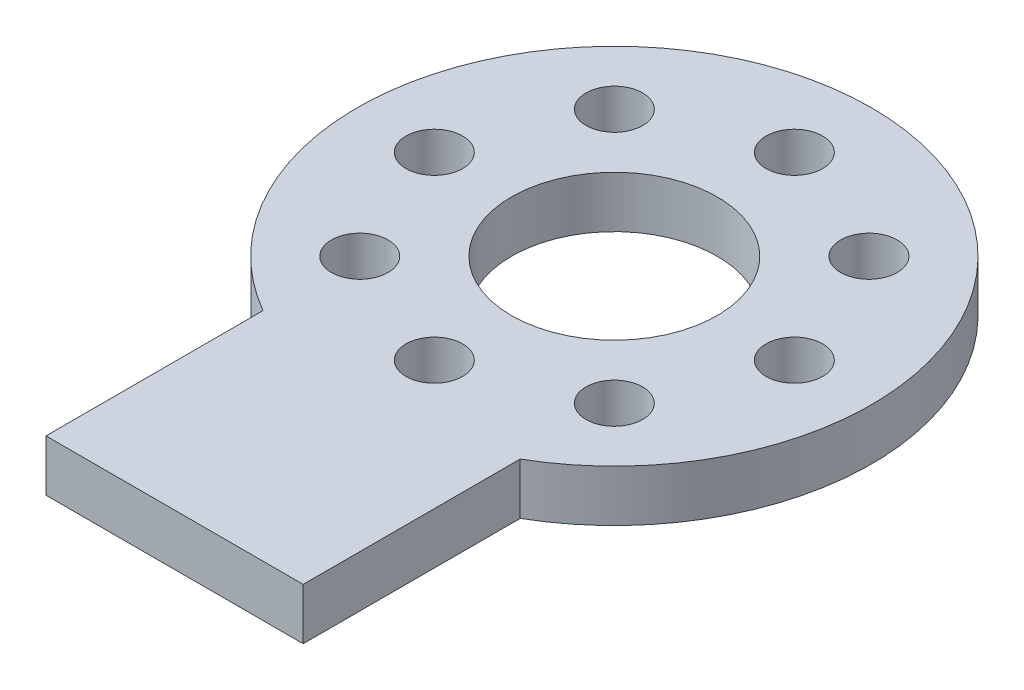
ISO-10303-21;
HEADER;
FILE_DESCRIPTION(('STEP AP214'),'2;1');
FILE_NAME('part.step','',(''),(''),'','','');
FILE_SCHEMA(('AUTOMOTIVE_DESIGN { 1 0 10303 214 1 1 1 1 }'));
ENDSEC;
DATA;
#1=APPLICATION_CONTEXT('core data for automotive mechanical design processes');
#2=APPLICATION_PROTOCOL_DEFINITION('international standard','automotive_design',2000,#1);
#3=PRODUCT_CONTEXT('',#1,'mechanical');
#4=PRODUCT('Part','Part','',(#3));
#5=PRODUCT_RELATED_PRODUCT_CATEGORY('part','',(#4));
#6=PRODUCT_DEFINITION_FORMATION('','',#4);
#7=PRODUCT_DEFINITION_CONTEXT('part definition',#1,'design');
#8=PRODUCT_DEFINITION('design','',#6,#7);
#9=PRODUCT_DEFINITION_SHAPE('','',#8);
#10=(LENGTH_UNIT() NAMED_UNIT(*) SI_UNIT(.MILLI.,.METRE.));
#11=(NAMED_UNIT(*) PLANE_ANGLE_UNIT() SI_UNIT($,.RADIAN.));
#12=(NAMED_UNIT(*) SI_UNIT($,.STERADIAN.) SOLID_ANGLE_UNIT());
#13=UNCERTAINTY_MEASURE_WITH_UNIT(LENGTH_MEASURE(1.E-05),#10,'distance_accuracy_value','');
#14=(GEOMETRIC_REPRESENTATION_CONTEXT(3) GLOBAL_UNCERTAINTY_ASSIGNED_CONTEXT((#13)) GLOBAL_UNIT_ASSIGNED_CONTEXT((#10,
#11,#12)) REPRESENTATION_CONTEXT('',''));
#15=CARTESIAN_POINT('',(0.,0.,0.));
#16=DIRECTION('',(0.,0.,1.));
#17=DIRECTION('',(1.,0.,0.));
#18=AXIS2_PLACEMENT_3D('',#15,#16,#17);
#19=CARTESIAN_POINT('',(-12.5,5.,42.7478866343424));
#20=DIRECTION('',(1.,0.,0.));
#21=DIRECTION('',(0.,0.,-1.));
#22=AXIS2_PLACEMENT_3D('',#19,#20,#21);
#23=PLANE('',#22);
#24=DIRECTION('',(0.,0.,1.));
#25=VECTOR('',#24,1.);
#26=CARTESIAN_POINT('',(-12.5,0.,42.7478866343424));
#27=LINE('',#26,#25);
#28=CARTESIAN_POINT('',(-12.5,0.,21.650635094611));
#29=VERTEX_POINT('',#28);
#30=CARTESIAN_POINT('',(-12.5,0.,42.7478866343424));
#31=VERTEX_POINT('',#30);
#32=EDGE_CURVE('E107',#29,#31,#27,.T.);
#33=ORIENTED_EDGE('',*,*,#32,.T.);
#34=DIRECTION('',(0.,-1.,0.));
#35=VECTOR('',#34,1.);
#36=CARTESIAN_POINT('',(-12.5,5.,42.7478866343424));
#37=LINE('',#36,#35);
#38=CARTESIAN_POINT('',(-12.5,5.,42.7478866343424));
#39=VERTEX_POINT('',#38);
#40=EDGE_CURVE('E11',#39,#31,#37,.T.);
#41=ORIENTED_EDGE('',*,*,#40,.F.);
#42=DIRECTION('',(0.,0.,1.));
#43=VECTOR('',#42,1.);
#44=CARTESIAN_POINT('',(-12.5,5.,42.7478866343424));
#45=LINE('',#44,#43);
#46=CARTESIAN_POINT('',(-12.5,5.,21.650635094611));
#47=VERTEX_POINT('',#46);
#48=EDGE_CURVE('E91',#47,#39,#45,.T.);
#49=ORIENTED_EDGE('',*,*,#48,.F.);
#50=DIRECTION('',(0.,-1.,0.));
#51=VECTOR('',#50,1.);
#52=CARTESIAN_POINT('',(-12.5,5.,21.650635094611));
#53=LINE('',#52,#51);
#54=EDGE_CURVE('E103',#47,#29,#53,.T.);
#55=ORIENTED_EDGE('',*,*,#54,.T.);
#56=EDGE_LOOP('',(#33,#41,#49,#55));
#57=FACE_BOUND('',#56,.T.);
#58=ADVANCED_FACE('F39',(#57),#23,.F.);
#59=CARTESIAN_POINT('',(-12.5,5.,42.7478866343424));
#60=DIRECTION('',(0.,0.,-1.));
#61=DIRECTION('',(-1.,0.,0.));
#62=AXIS2_PLACEMENT_3D('',#59,#60,#61);
#63=PLANE('',#62);
#64=DIRECTION('',(1.,0.,0.));
#65=VECTOR('',#64,1.);
#66=CARTESIAN_POINT('',(-12.5,0.,42.7478866343424));
#67=LINE('',#66,#65);
#68=CARTESIAN_POINT('',(12.5,0.,42.7478866343424));
#69=VERTEX_POINT('',#68);
#70=EDGE_CURVE('E96',#31,#69,#67,.T.);
#71=ORIENTED_EDGE('',*,*,#70,.T.);
#72=DIRECTION('',(0.,-1.,0.));
#73=VECTOR('',#72,1.);
#74=CARTESIAN_POINT('',(12.5,5.,42.7478866343424));
#75=LINE('',#74,#73);
#76=CARTESIAN_POINT('',(12.5,5.,42.7478866343424));
#77=VERTEX_POINT('',#76);
#78=EDGE_CURVE('E48',#77,#69,#75,.T.);
#79=ORIENTED_EDGE('',*,*,#78,.F.);
#80=DIRECTION('',(1.,0.,0.));
#81=VECTOR('',#80,1.);
#82=CARTESIAN_POINT('',(-12.5,5.,42.7478866343424));
#83=LINE('',#82,#81);
#84=EDGE_CURVE('E86',#39,#77,#83,.T.);
#85=ORIENTED_EDGE('',*,*,#84,.F.);
#86=ORIENTED_EDGE('',*,*,#40,.T.);
#87=EDGE_LOOP('',(#71,#79,#85,#86));
#88=FACE_BOUND('',#87,.T.);
#89=ADVANCED_FACE('F95',(#88),#63,.F.);
#90=CARTESIAN_POINT('',(12.5,5.,42.7478866343424));
#91=DIRECTION('',(-1.,0.,0.));
#92=DIRECTION('',(0.,0.,1.));
#93=AXIS2_PLACEMENT_3D('',#90,#91,#92);
#94=PLANE('',#93);
#95=DIRECTION('',(0.,0.,-1.));
#96=VECTOR('',#95,1.);
#97=CARTESIAN_POINT('',(12.5,0.,42.7478866343424));
#98=LINE('',#97,#96);
#99=CARTESIAN_POINT('',(12.5,0.,21.650635094611));
#100=VERTEX_POINT('',#99);
#101=EDGE_CURVE('E73',#69,#100,#98,.T.);
#102=ORIENTED_EDGE('',*,*,#101,.T.);
#103=DIRECTION('',(0.,-1.,0.));
#104=VECTOR('',#103,1.);
#105=CARTESIAN_POINT('',(12.5,5.,21.650635094611));
#106=LINE('',#105,#104);
#107=CARTESIAN_POINT('',(12.5,5.,21.650635094611));
#108=VERTEX_POINT('',#107);
#109=EDGE_CURVE('E98',#108,#100,#106,.T.);
#110=ORIENTED_EDGE('',*,*,#109,.F.);
#111=DIRECTION('',(0.,0.,-1.));
#112=VECTOR('',#111,1.);
#113=CARTESIAN_POINT('',(12.5,5.,42.7478866343424));
#114=LINE('',#113,#112);
#115=EDGE_CURVE('E89',#77,#108,#114,.T.);
#116=ORIENTED_EDGE('',*,*,#115,.F.);
#117=ORIENTED_EDGE('',*,*,#78,.T.);
#118=EDGE_LOOP('',(#102,#110,#116,#117));
#119=FACE_BOUND('',#118,.T.);
#120=ADVANCED_FACE('F99',(#119),#94,.F.);
#121=CARTESIAN_POINT('',(0.,5.,0.));
#122=DIRECTION('',(0.,-1.,0.));
#123=DIRECTION('',(0.,0.,-1.));
#124=AXIS2_PLACEMENT_3D('',#121,#122,#123);
#125=CYLINDRICAL_SURFACE('',#124,25.);
#126=CARTESIAN_POINT('',(0.,0.,0.));
#127=DIRECTION('',(0.,1.,0.));
#128=DIRECTION('',(0.,0.,1.));
#129=AXIS2_PLACEMENT_3D('',#126,#127,#128);
#130=CIRCLE('',#129,25.);
#131=EDGE_CURVE('E79',#100,#29,#130,.T.);
#132=ORIENTED_EDGE('',*,*,#131,.T.);
#133=ORIENTED_EDGE('',*,*,#54,.F.);
#134=CARTESIAN_POINT('',(0.,5.,0.));
#135=DIRECTION('',(0.,1.,0.));
#136=DIRECTION('',(0.,0.,1.));
#137=AXIS2_PLACEMENT_3D('',#134,#135,#136);
#138=CIRCLE('',#137,25.);
#139=EDGE_CURVE('E56',#108,#47,#138,.T.);
#140=ORIENTED_EDGE('',*,*,#139,.F.);
#141=ORIENTED_EDGE('',*,*,#109,.T.);
#142=EDGE_LOOP('',(#132,#133,#140,#141));
#143=FACE_BOUND('',#142,.T.);
#144=ADVANCED_FACE('F121',(#143),#125,.T.);
#145=CARTESIAN_POINT('',(0.,5.,0.));
#146=DIRECTION('',(0.,1.,0.));
#147=DIRECTION('',(0.,0.,1.));
#148=AXIS2_PLACEMENT_3D('',#145,#146,#147);
#149=PLANE('',#148);
#150=CARTESIAN_POINT('',(0.,5.,0.));
#151=DIRECTION('',(0.,1.,0.));
#152=DIRECTION('',(0.,0.,1.));
#153=AXIS2_PLACEMENT_3D('',#150,#151,#152);
#154=CIRCLE('',#153,10.);
#155=CARTESIAN_POINT('',(0.,5.,10.));
#156=VERTEX_POINT('',#155);
#157=EDGE_CURVE('E192',#156,#156,#154,.T.);
#158=ORIENTED_EDGE('',*,*,#157,.F.);
#159=EDGE_LOOP('',(#158));
#160=FACE_BOUND('',#159,.T.);
#161=CARTESIAN_POINT('',(-12.3743686707641,5.,-12.3743686707635));
#162=DIRECTION('',(0.,1.,0.));
#163=DIRECTION('',(0.,0.,1.));
#164=AXIS2_PLACEMENT_3D('',#161,#162,#163);
#165=CIRCLE('',#164,2.75);
#166=CARTESIAN_POINT('',(-12.3743686707641,5.,-9.62436867076348));
#167=VERTEX_POINT('',#166);
#168=EDGE_CURVE('E187',#167,#167,#165,.T.);
#169=ORIENTED_EDGE('',*,*,#168,.F.);
#170=EDGE_LOOP('',(#169));
#171=FACE_BOUND('',#170,.T.);
#172=CARTESIAN_POINT('',(0.,5.,-17.5));
#173=DIRECTION('',(0.,1.,0.));
#174=DIRECTION('',(0.,0.,1.));
#175=AXIS2_PLACEMENT_3D('',#172,#173,#174);
#176=CIRCLE('',#175,2.75);
#177=CARTESIAN_POINT('',(0.,5.,-14.75));
#178=VERTEX_POINT('',#177);
#179=EDGE_CURVE('E179',#178,#178,#176,.T.);
#180=ORIENTED_EDGE('',*,*,#179,.F.);
#181=EDGE_LOOP('',(#180));
#182=FACE_BOUND('',#181,.T.);
#183=CARTESIAN_POINT('',(12.374368670765,5.,-12.3743686707657));
#184=DIRECTION('',(0.,1.,0.));
#185=DIRECTION('',(0.,0.,1.));
#186=AXIS2_PLACEMENT_3D('',#183,#184,#185);
#187=CIRCLE('',#186,2.75);
#188=CARTESIAN_POINT('',(12.374368670765,5.,-9.62436867076568));
#189=VERTEX_POINT('',#188);
#190=EDGE_CURVE('E171',#189,#189,#187,.T.);
#191=ORIENTED_EDGE('',*,*,#190,.F.);
#192=EDGE_LOOP('',(#191));
#193=FACE_BOUND('',#192,.T.);
#194=CARTESIAN_POINT('',(17.5000000000016,5.,-1.55514127300912E-12));
#195=DIRECTION('',(0.,1.,0.));
#196=DIRECTION('',(0.,0.,1.));
#197=AXIS2_PLACEMENT_3D('',#194,#195,#196);
#198=CIRCLE('',#197,2.75);
#199=CARTESIAN_POINT('',(17.5000000000016,5.,2.74999999999844));
#200=VERTEX_POINT('',#199);
#201=EDGE_CURVE('E163',#200,#200,#198,.T.);
#202=ORIENTED_EDGE('',*,*,#201,.F.);
#203=EDGE_LOOP('',(#202));
#204=FACE_BOUND('',#203,.T.);
#205=CARTESIAN_POINT('',(12.3743686707672,5.,12.3743686707635));
#206=DIRECTION('',(0.,1.,0.));
#207=DIRECTION('',(0.,0.,1.));
#208=AXIS2_PLACEMENT_3D('',#205,#206,#207);
#209=CIRCLE('',#208,2.75);
#210=CARTESIAN_POINT('',(12.3743686707672,5.,15.1243686707635));
#211=VERTEX_POINT('',#210);
#212=EDGE_CURVE('E155',#211,#211,#209,.T.);
#213=ORIENTED_EDGE('',*,*,#212,.F.);
#214=EDGE_LOOP('',(#213));
#215=FACE_BOUND('',#214,.T.);
#216=CARTESIAN_POINT('',(3.11028254601824E-12,5.,17.5));
#217=DIRECTION('',(0.,1.,0.));
#218=DIRECTION('',(0.,0.,1.));
#219=AXIS2_PLACEMENT_3D('',#216,#217,#218);
#220=CIRCLE('',#219,2.75);
#221=CARTESIAN_POINT('',(3.11028254601824E-12,5.,20.25));
#222=VERTEX_POINT('',#221);
#223=EDGE_CURVE('E147',#222,#222,#220,.T.);
#224=ORIENTED_EDGE('',*,*,#223,.F.);
#225=EDGE_LOOP('',(#224));
#226=FACE_BOUND('',#225,.T.);
#227=CARTESIAN_POINT('',(-12.3743686707619,5.,12.3743686707657));
#228=DIRECTION('',(0.,1.,0.));
#229=DIRECTION('',(0.,0.,1.));
#230=AXIS2_PLACEMENT_3D('',#227,#228,#229);
#231=CIRCLE('',#230,2.75);
#232=CARTESIAN_POINT('',(-12.3743686707619,5.,15.1243686707657));
#233=VERTEX_POINT('',#232);
#234=EDGE_CURVE('E139',#233,#233,#231,.T.);
#235=ORIENTED_EDGE('',*,*,#234,.F.);
#236=EDGE_LOOP('',(#235));
#237=FACE_BOUND('',#236,.T.);
#238=CARTESIAN_POINT('',(-17.4999999999984,5.,1.55728440490763E-12));
#239=DIRECTION('',(0.,1.,0.));
#240=DIRECTION('',(0.,0.,1.));
#241=AXIS2_PLACEMENT_3D('',#238,#239,#240);
#242=CIRCLE('',#241,2.75);
#243=CARTESIAN_POINT('',(-17.4999999999984,5.,2.75000000000156));
#244=VERTEX_POINT('',#243);
#245=EDGE_CURVE('E131',#244,#244,#242,.T.);
#246=ORIENTED_EDGE('',*,*,#245,.F.);
#247=EDGE_LOOP('',(#246));
#248=FACE_BOUND('',#247,.T.);
#249=ORIENTED_EDGE('',*,*,#48,.T.);
#250=ORIENTED_EDGE('',*,*,#84,.T.);
#251=ORIENTED_EDGE('',*,*,#115,.T.);
#252=ORIENTED_EDGE('',*,*,#139,.T.);
#253=EDGE_LOOP('',(#249,#250,#251,#252));
#254=FACE_BOUND('',#253,.T.);
#255=ADVANCED_FACE('F87',(#160,#171,#182,#193,#204,#215,#226,#237,#248,#254),#149,.T.);
#256=CARTESIAN_POINT('',(0.,0.,0.));
#257=DIRECTION('',(0.,1.,0.));
#258=DIRECTION('',(0.,0.,1.));
#259=AXIS2_PLACEMENT_3D('',#256,#257,#258);
#260=PLANE('',#259);
#261=CARTESIAN_POINT('',(0.,0.,0.));
#262=DIRECTION('',(0.,1.,0.));
#263=DIRECTION('',(0.,0.,1.));
#264=AXIS2_PLACEMENT_3D('',#261,#262,#263);
#265=CIRCLE('',#264,10.);
#266=CARTESIAN_POINT('',(0.,0.,10.));
#267=VERTEX_POINT('',#266);
#268=EDGE_CURVE('E191',#267,#267,#265,.T.);
#269=ORIENTED_EDGE('',*,*,#268,.T.);
#270=EDGE_LOOP('',(#269));
#271=FACE_BOUND('',#270,.T.);
#272=CARTESIAN_POINT('',(-12.3743686707641,0.,-12.3743686707635));
#273=DIRECTION('',(0.,1.,0.));
#274=DIRECTION('',(0.,0.,1.));
#275=AXIS2_PLACEMENT_3D('',#272,#273,#274);
#276=CIRCLE('',#275,2.75);
#277=CARTESIAN_POINT('',(-12.3743686707641,0.,-9.62436867076348));
#278=VERTEX_POINT('',#277);
#279=EDGE_CURVE('E183',#278,#278,#276,.T.);
#280=ORIENTED_EDGE('',*,*,#279,.T.);
#281=EDGE_LOOP('',(#280));
#282=FACE_BOUND('',#281,.T.);
#283=CARTESIAN_POINT('',(0.,0.,-17.5));
#284=DIRECTION('',(0.,1.,0.));
#285=DIRECTION('',(0.,0.,1.));
#286=AXIS2_PLACEMENT_3D('',#283,#284,#285);
#287=CIRCLE('',#286,2.75);
#288=CARTESIAN_POINT('',(0.,0.,-14.75));
#289=VERTEX_POINT('',#288);
#290=EDGE_CURVE('E175',#289,#289,#287,.T.);
#291=ORIENTED_EDGE('',*,*,#290,.T.);
#292=EDGE_LOOP('',(#291));
#293=FACE_BOUND('',#292,.T.);
#294=CARTESIAN_POINT('',(12.374368670765,0.,-12.3743686707657));
#295=DIRECTION('',(0.,1.,0.));
#296=DIRECTION('',(0.,0.,1.));
#297=AXIS2_PLACEMENT_3D('',#294,#295,#296);
#298=CIRCLE('',#297,2.75);
#299=CARTESIAN_POINT('',(12.374368670765,0.,-9.62436867076568));
#300=VERTEX_POINT('',#299);
#301=EDGE_CURVE('E167',#300,#300,#298,.T.);
#302=ORIENTED_EDGE('',*,*,#301,.T.);
#303=EDGE_LOOP('',(#302));
#304=FACE_BOUND('',#303,.T.);
#305=CARTESIAN_POINT('',(17.5000000000016,0.,-1.55514127300912E-12));
#306=DIRECTION('',(0.,1.,0.));
#307=DIRECTION('',(0.,0.,1.));
#308=AXIS2_PLACEMENT_3D('',#305,#306,#307);
#309=CIRCLE('',#308,2.75);
#310=CARTESIAN_POINT('',(17.5000000000016,0.,2.74999999999844));
#311=VERTEX_POINT('',#310);
#312=EDGE_CURVE('E159',#311,#311,#309,.T.);
#313=ORIENTED_EDGE('',*,*,#312,.T.);
#314=EDGE_LOOP('',(#313));
#315=FACE_BOUND('',#314,.T.);
#316=CARTESIAN_POINT('',(12.3743686707672,0.,12.3743686707635));
#317=DIRECTION('',(0.,1.,0.));
#318=DIRECTION('',(0.,0.,1.));
#319=AXIS2_PLACEMENT_3D('',#316,#317,#318);
#320=CIRCLE('',#319,2.75);
#321=CARTESIAN_POINT('',(12.3743686707672,0.,15.1243686707635));
#322=VERTEX_POINT('',#321);
#323=EDGE_CURVE('E151',#322,#322,#320,.T.);
#324=ORIENTED_EDGE('',*,*,#323,.T.);
#325=EDGE_LOOP('',(#324));
#326=FACE_BOUND('',#325,.T.);
#327=CARTESIAN_POINT('',(3.11028254601824E-12,0.,17.5));
#328=DIRECTION('',(0.,1.,0.));
#329=DIRECTION('',(0.,0.,1.));
#330=AXIS2_PLACEMENT_3D('',#327,#328,#329);
#331=CIRCLE('',#330,2.75);
#332=CARTESIAN_POINT('',(3.11028254601824E-12,0.,20.25));
#333=VERTEX_POINT('',#332);
#334=EDGE_CURVE('E143',#333,#333,#331,.T.);
#335=ORIENTED_EDGE('',*,*,#334,.T.);
#336=EDGE_LOOP('',(#335));
#337=FACE_BOUND('',#336,.T.);
#338=CARTESIAN_POINT('',(-12.3743686707619,0.,12.3743686707657));
#339=DIRECTION('',(0.,1.,0.));
#340=DIRECTION('',(0.,0.,1.));
#341=AXIS2_PLACEMENT_3D('',#338,#339,#340);
#342=CIRCLE('',#341,2.75);
#343=CARTESIAN_POINT('',(-12.3743686707619,0.,15.1243686707657));
#344=VERTEX_POINT('',#343);
#345=EDGE_CURVE('E135',#344,#344,#342,.T.);
#346=ORIENTED_EDGE('',*,*,#345,.T.);
#347=EDGE_LOOP('',(#346));
#348=FACE_BOUND('',#347,.T.);
#349=CARTESIAN_POINT('',(-17.4999999999984,0.,1.55728440490763E-12));
#350=DIRECTION('',(0.,1.,0.));
#351=DIRECTION('',(0.,0.,1.));
#352=AXIS2_PLACEMENT_3D('',#349,#350,#351);
#353=CIRCLE('',#352,2.75);
#354=CARTESIAN_POINT('',(-17.4999999999984,0.,2.75000000000156));
#355=VERTEX_POINT('',#354);
#356=EDGE_CURVE('E111',#355,#355,#353,.T.);
#357=ORIENTED_EDGE('',*,*,#356,.T.);
#358=EDGE_LOOP('',(#357));
#359=FACE_BOUND('',#358,.T.);
#360=ORIENTED_EDGE('',*,*,#32,.F.);
#361=ORIENTED_EDGE('',*,*,#131,.F.);
#362=ORIENTED_EDGE('',*,*,#101,.F.);
#363=ORIENTED_EDGE('',*,*,#70,.F.);
#364=EDGE_LOOP('',(#360,#361,#362,#363));
#365=FACE_BOUND('',#364,.T.);
#366=ADVANCED_FACE('F124',(#271,#282,#293,#304,#315,#326,#337,#348,#359,#365),#260,.F.);
#367=CARTESIAN_POINT('',(-17.4999999999984,5.,1.55728440490763E-12));
#368=DIRECTION('',(0.,1.,0.));
#369=DIRECTION('',(0.,0.,1.));
#370=AXIS2_PLACEMENT_3D('',#367,#368,#369);
#371=CYLINDRICAL_SURFACE('',#370,2.75);
#372=ORIENTED_EDGE('',*,*,#356,.F.);
#373=EDGE_LOOP('',(#372));
#374=FACE_BOUND('',#373,.T.);
#375=ORIENTED_EDGE('',*,*,#245,.T.);
#376=EDGE_LOOP('',(#375));
#377=FACE_BOUND('',#376,.T.);
#378=ADVANCED_FACE('F228',(#374,#377),#371,.F.);
#379=CARTESIAN_POINT('',(-12.3743686707619,5.,12.3743686707657));
#380=DIRECTION('',(0.,1.,0.));
#381=DIRECTION('',(0.,0.,1.));
#382=AXIS2_PLACEMENT_3D('',#379,#380,#381);
#383=CYLINDRICAL_SURFACE('',#382,2.75);
#384=ORIENTED_EDGE('',*,*,#345,.F.);
#385=EDGE_LOOP('',(#384));
#386=FACE_BOUND('',#385,.T.);
#387=ORIENTED_EDGE('',*,*,#234,.T.);
#388=EDGE_LOOP('',(#387));
#389=FACE_BOUND('',#388,.T.);
#390=ADVANCED_FACE('F230',(#386,#389),#383,.F.);
#391=CARTESIAN_POINT('',(3.11028254601824E-12,5.,17.5));
#392=DIRECTION('',(0.,1.,0.));
#393=DIRECTION('',(0.,0.,1.));
#394=AXIS2_PLACEMENT_3D('',#391,#392,#393);
#395=CYLINDRICAL_SURFACE('',#394,2.75);
#396=ORIENTED_EDGE('',*,*,#334,.F.);
#397=EDGE_LOOP('',(#396));
#398=FACE_BOUND('',#397,.T.);
#399=ORIENTED_EDGE('',*,*,#223,.T.);
#400=EDGE_LOOP('',(#399));
#401=FACE_BOUND('',#400,.T.);
#402=ADVANCED_FACE('F237',(#398,#401),#395,.F.);
#403=CARTESIAN_POINT('',(12.3743686707672,5.,12.3743686707635));
#404=DIRECTION('',(0.,1.,0.));
#405=DIRECTION('',(0.,0.,1.));
#406=AXIS2_PLACEMENT_3D('',#403,#404,#405);
#407=CYLINDRICAL_SURFACE('',#406,2.75);
#408=ORIENTED_EDGE('',*,*,#323,.F.);
#409=EDGE_LOOP('',(#408));
#410=FACE_BOUND('',#409,.T.);
#411=ORIENTED_EDGE('',*,*,#212,.T.);
#412=EDGE_LOOP('',(#411));
#413=FACE_BOUND('',#412,.T.);
#414=ADVANCED_FACE('F303',(#410,#413),#407,.F.);
#415=CARTESIAN_POINT('',(17.5000000000016,5.,-1.55514127300912E-12));
#416=DIRECTION('',(0.,1.,0.));
#417=DIRECTION('',(0.,0.,1.));
#418=AXIS2_PLACEMENT_3D('',#415,#416,#417);
#419=CYLINDRICAL_SURFACE('',#418,2.75);
#420=ORIENTED_EDGE('',*,*,#312,.F.);
#421=EDGE_LOOP('',(#420));
#422=FACE_BOUND('',#421,.T.);
#423=ORIENTED_EDGE('',*,*,#201,.T.);
#424=EDGE_LOOP('',(#423));
#425=FACE_BOUND('',#424,.T.);
#426=ADVANCED_FACE('F295',(#422,#425),#419,.F.);
#427=CARTESIAN_POINT('',(12.374368670765,5.,-12.3743686707657));
#428=DIRECTION('',(0.,1.,0.));
#429=DIRECTION('',(0.,0.,1.));
#430=AXIS2_PLACEMENT_3D('',#427,#428,#429);
#431=CYLINDRICAL_SURFACE('',#430,2.75);
#432=ORIENTED_EDGE('',*,*,#301,.F.);
#433=EDGE_LOOP('',(#432));
#434=FACE_BOUND('',#433,.T.);
#435=ORIENTED_EDGE('',*,*,#190,.T.);
#436=EDGE_LOOP('',(#435));
#437=FACE_BOUND('',#436,.T.);
#438=ADVANCED_FACE('F287',(#434,#437),#431,.F.);
#439=CARTESIAN_POINT('',(0.,5.,-17.5));
#440=DIRECTION('',(0.,1.,0.));
#441=DIRECTION('',(0.,0.,1.));
#442=AXIS2_PLACEMENT_3D('',#439,#440,#441);
#443=CYLINDRICAL_SURFACE('',#442,2.75);
#444=ORIENTED_EDGE('',*,*,#290,.F.);
#445=EDGE_LOOP('',(#444));
#446=FACE_BOUND('',#445,.T.);
#447=ORIENTED_EDGE('',*,*,#179,.T.);
#448=EDGE_LOOP('',(#447));
#449=FACE_BOUND('',#448,.T.);
#450=ADVANCED_FACE('F280',(#446,#449),#443,.F.);
#451=CARTESIAN_POINT('',(-12.3743686707641,5.,-12.3743686707635));
#452=DIRECTION('',(0.,1.,0.));
#453=DIRECTION('',(0.,0.,1.));
#454=AXIS2_PLACEMENT_3D('',#451,#452,#453);
#455=CYLINDRICAL_SURFACE('',#454,2.75);
#456=ORIENTED_EDGE('',*,*,#279,.F.);
#457=EDGE_LOOP('',(#456));
#458=FACE_BOUND('',#457,.T.);
#459=ORIENTED_EDGE('',*,*,#168,.T.);
#460=EDGE_LOOP('',(#459));
#461=FACE_BOUND('',#460,.T.);
#462=ADVANCED_FACE('F205',(#458,#461),#455,.F.);
#463=CARTESIAN_POINT('',(0.,0.,0.));
#464=DIRECTION('',(0.,1.,0.));
#465=DIRECTION('',(0.,0.,1.));
#466=AXIS2_PLACEMENT_3D('',#463,#464,#465);
#467=CYLINDRICAL_SURFACE('',#466,10.);
#468=ORIENTED_EDGE('',*,*,#268,.F.);
#469=EDGE_LOOP('',(#468));
#470=FACE_BOUND('',#469,.T.);
#471=ORIENTED_EDGE('',*,*,#157,.T.);
#472=EDGE_LOOP('',(#471));
#473=FACE_BOUND('',#472,.T.);
#474=ADVANCED_FACE('F202',(#470,#473),#467,.F.);
#475=CLOSED_SHELL('',(#58,#89,#120,#144,#255,#366,#378,#390,#402,#414,#426,#438,#450,#462,#474));
#476=MANIFOLD_SOLID_BREP('B2',#475);
#477=ADVANCED_BREP_SHAPE_REPRESENTATION('',(#18,#476),#14);
#478=SHAPE_DEFINITION_REPRESENTATION(#9,#477);
ENDSEC;
END-ISO-10303-21;
